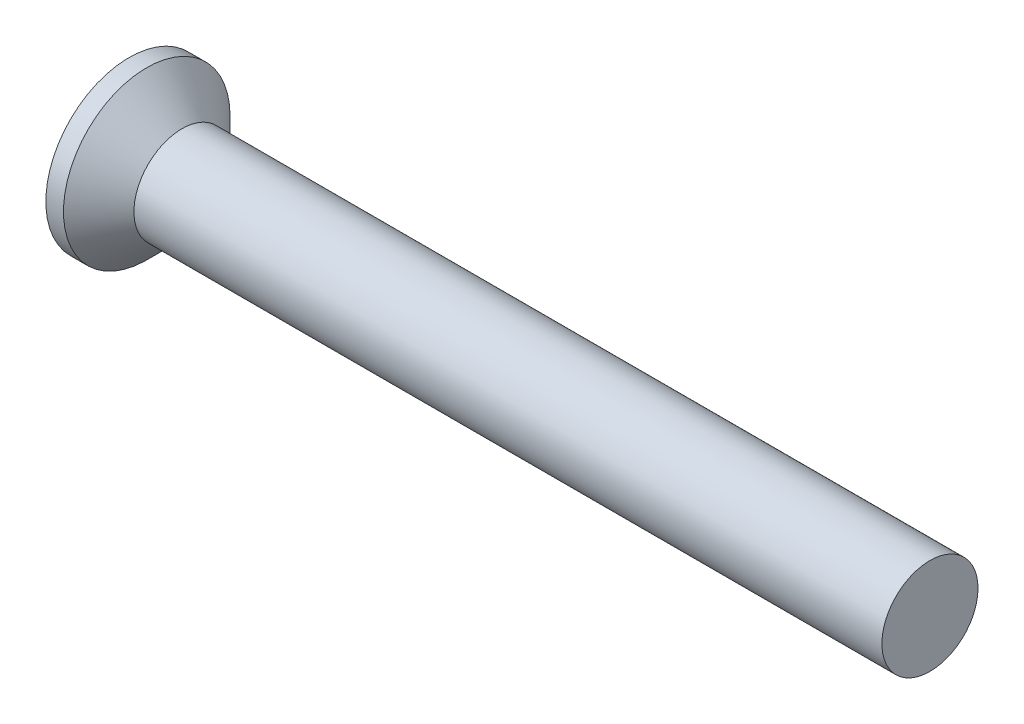
ISO-10303-21;
HEADER;
FILE_DESCRIPTION(('STEP AP214'),'2;1');
FILE_NAME('part.step','',(''),(''),'','','');
FILE_SCHEMA(('AUTOMOTIVE_DESIGN { 1 0 10303 214 1 1 1 1 }'));
ENDSEC;
DATA;
#1=APPLICATION_CONTEXT('core data for automotive mechanical design processes');
#2=APPLICATION_PROTOCOL_DEFINITION('international standard','automotive_design',2000,#1);
#3=PRODUCT_CONTEXT('',#1,'mechanical');
#4=PRODUCT('Part','Part','',(#3));
#5=PRODUCT_RELATED_PRODUCT_CATEGORY('part','',(#4));
#6=PRODUCT_DEFINITION_FORMATION('','',#4);
#7=PRODUCT_DEFINITION_CONTEXT('part definition',#1,'design');
#8=PRODUCT_DEFINITION('design','',#6,#7);
#9=PRODUCT_DEFINITION_SHAPE('','',#8);
#10=(LENGTH_UNIT() NAMED_UNIT(*) SI_UNIT(.MILLI.,.METRE.));
#11=(NAMED_UNIT(*) PLANE_ANGLE_UNIT() SI_UNIT($,.RADIAN.));
#12=(NAMED_UNIT(*) SI_UNIT($,.STERADIAN.) SOLID_ANGLE_UNIT());
#13=UNCERTAINTY_MEASURE_WITH_UNIT(LENGTH_MEASURE(1.E-05),#10,'distance_accuracy_value','');
#14=(GEOMETRIC_REPRESENTATION_CONTEXT(3) GLOBAL_UNCERTAINTY_ASSIGNED_CONTEXT((#13)) GLOBAL_UNIT_ASSIGNED_CONTEXT((#10,
#11,#12)) REPRESENTATION_CONTEXT('',''));
#15=CARTESIAN_POINT('',(0.,0.,0.));
#16=DIRECTION('',(0.,0.,1.));
#17=DIRECTION('',(1.,0.,0.));
#18=AXIS2_PLACEMENT_3D('',#15,#16,#17);
#19=CARTESIAN_POINT('',(0.,2.6,0.));
#20=DIRECTION('',(-1.,0.,0.));
#21=DIRECTION('',(0.,0.,1.));
#22=AXIS2_PLACEMENT_3D('',#19,#20,#21);
#23=PLANE('',#22);
#24=CARTESIAN_POINT('',(0.,0.,0.));
#25=DIRECTION('',(1.,0.,0.));
#26=DIRECTION('',(0.,0.,-1.));
#27=AXIS2_PLACEMENT_3D('',#24,#25,#26);
#28=CIRCLE('',#27,2.6);
#29=CARTESIAN_POINT('',(0.,0.,-2.6));
#30=VERTEX_POINT('',#29);
#31=EDGE_CURVE('E183',#30,#30,#28,.T.);
#32=ORIENTED_EDGE('',*,*,#31,.F.);
#33=EDGE_LOOP('',(#32));
#34=FACE_BOUND('',#33,.T.);
#35=DIRECTION('',(0.,1.,0.));
#36=VECTOR('',#35,1.);
#37=CARTESIAN_POINT('',(0.,-0.32,-0.32));
#38=LINE('',#37,#36);
#39=CARTESIAN_POINT('',(0.,-1.6,-0.32));
#40=VERTEX_POINT('',#39);
#41=CARTESIAN_POINT('',(0.,-0.62,-0.32));
#42=VERTEX_POINT('',#41);
#43=EDGE_CURVE('E287',#40,#42,#38,.T.);
#44=ORIENTED_EDGE('',*,*,#43,.T.);
#45=CARTESIAN_POINT('',(0.,-0.62,-0.62));
#46=DIRECTION('',(-1.,0.,0.));
#47=DIRECTION('',(0.,0.,1.));
#48=AXIS2_PLACEMENT_3D('',#45,#46,#47);
#49=CIRCLE('',#48,0.3);
#50=CARTESIAN_POINT('',(0.,-0.32,-0.62));
#51=VERTEX_POINT('',#50);
#52=EDGE_CURVE('E189',#42,#51,#49,.T.);
#53=ORIENTED_EDGE('',*,*,#52,.T.);
#54=DIRECTION('',(0.,0.,-1.));
#55=VECTOR('',#54,1.);
#56=CARTESIAN_POINT('',(0.,-0.32,-0.32));
#57=LINE('',#56,#55);
#58=CARTESIAN_POINT('',(0.,-0.32,-1.6));
#59=VERTEX_POINT('',#58);
#60=EDGE_CURVE('E282',#51,#59,#57,.T.);
#61=ORIENTED_EDGE('',*,*,#60,.T.);
#62=DIRECTION('',(0.,1.,0.));
#63=VECTOR('',#62,1.);
#64=CARTESIAN_POINT('',(0.,0.32,-1.6));
#65=LINE('',#64,#63);
#66=CARTESIAN_POINT('',(0.,0.32,-1.6));
#67=VERTEX_POINT('',#66);
#68=EDGE_CURVE('E246',#59,#67,#65,.T.);
#69=ORIENTED_EDGE('',*,*,#68,.T.);
#70=DIRECTION('',(0.,0.,1.));
#71=VECTOR('',#70,1.);
#72=CARTESIAN_POINT('',(0.,0.32,-0.32));
#73=LINE('',#72,#71);
#74=CARTESIAN_POINT('',(0.,0.32,-0.62));
#75=VERTEX_POINT('',#74);
#76=EDGE_CURVE('E236',#67,#75,#73,.T.);
#77=ORIENTED_EDGE('',*,*,#76,.T.);
#78=CARTESIAN_POINT('',(0.,0.62,-0.62));
#79=DIRECTION('',(-1.,0.,0.));
#80=DIRECTION('',(0.,0.,1.));
#81=AXIS2_PLACEMENT_3D('',#78,#79,#80);
#82=CIRCLE('',#81,0.3);
#83=CARTESIAN_POINT('',(0.,0.62,-0.32));
#84=VERTEX_POINT('',#83);
#85=EDGE_CURVE('E185',#75,#84,#82,.T.);
#86=ORIENTED_EDGE('',*,*,#85,.T.);
#87=DIRECTION('',(0.,1.,0.));
#88=VECTOR('',#87,1.);
#89=CARTESIAN_POINT('',(0.,0.32,-0.32));
#90=LINE('',#89,#88);
#91=CARTESIAN_POINT('',(0.,1.6,-0.32));
#92=VERTEX_POINT('',#91);
#93=EDGE_CURVE('E233',#84,#92,#90,.T.);
#94=ORIENTED_EDGE('',*,*,#93,.T.);
#95=DIRECTION('',(0.,0.,1.));
#96=VECTOR('',#95,1.);
#97=CARTESIAN_POINT('',(0.,1.6,-0.32));
#98=LINE('',#97,#96);
#99=CARTESIAN_POINT('',(0.,1.6,0.32));
#100=VERTEX_POINT('',#99);
#101=EDGE_CURVE('E242',#92,#100,#98,.T.);
#102=ORIENTED_EDGE('',*,*,#101,.T.);
#103=DIRECTION('',(0.,-1.,0.));
#104=VECTOR('',#103,1.);
#105=CARTESIAN_POINT('',(0.,0.32,0.32));
#106=LINE('',#105,#104);
#107=CARTESIAN_POINT('',(0.,0.62,0.32));
#108=VERTEX_POINT('',#107);
#109=EDGE_CURVE('E244',#100,#108,#106,.T.);
#110=ORIENTED_EDGE('',*,*,#109,.T.);
#111=CARTESIAN_POINT('',(0.,0.62,0.62));
#112=DIRECTION('',(-1.,0.,0.));
#113=DIRECTION('',(0.,0.,1.));
#114=AXIS2_PLACEMENT_3D('',#111,#112,#113);
#115=CIRCLE('',#114,0.3);
#116=CARTESIAN_POINT('',(0.,0.32,0.62));
#117=VERTEX_POINT('',#116);
#118=EDGE_CURVE('E155',#108,#117,#115,.T.);
#119=ORIENTED_EDGE('',*,*,#118,.T.);
#120=DIRECTION('',(0.,0.,1.));
#121=VECTOR('',#120,1.);
#122=CARTESIAN_POINT('',(0.,0.32,0.32));
#123=LINE('',#122,#121);
#124=CARTESIAN_POINT('',(0.,0.32,1.6));
#125=VERTEX_POINT('',#124);
#126=EDGE_CURVE('E149',#117,#125,#123,.T.);
#127=ORIENTED_EDGE('',*,*,#126,.T.);
#128=DIRECTION('',(0.,-1.,0.));
#129=VECTOR('',#128,1.);
#130=CARTESIAN_POINT('',(0.,0.32,1.6));
#131=LINE('',#130,#129);
#132=CARTESIAN_POINT('',(0.,-0.32,1.6));
#133=VERTEX_POINT('',#132);
#134=EDGE_CURVE('E153',#125,#133,#131,.T.);
#135=ORIENTED_EDGE('',*,*,#134,.T.);
#136=DIRECTION('',(0.,0.,-1.));
#137=VECTOR('',#136,1.);
#138=CARTESIAN_POINT('',(0.,-0.32,0.32));
#139=LINE('',#138,#137);
#140=CARTESIAN_POINT('',(0.,-0.32,0.62));
#141=VERTEX_POINT('',#140);
#142=EDGE_CURVE('E165',#133,#141,#139,.T.);
#143=ORIENTED_EDGE('',*,*,#142,.T.);
#144=CARTESIAN_POINT('',(0.,-0.62,0.62));
#145=DIRECTION('',(-1.,0.,0.));
#146=DIRECTION('',(0.,0.,1.));
#147=AXIS2_PLACEMENT_3D('',#144,#145,#146);
#148=CIRCLE('',#147,0.3);
#149=CARTESIAN_POINT('',(0.,-0.62,0.32));
#150=VERTEX_POINT('',#149);
#151=EDGE_CURVE('E187',#141,#150,#148,.T.);
#152=ORIENTED_EDGE('',*,*,#151,.T.);
#153=DIRECTION('',(0.,-1.,0.));
#154=VECTOR('',#153,1.);
#155=CARTESIAN_POINT('',(0.,-0.32,0.32));
#156=LINE('',#155,#154);
#157=CARTESIAN_POINT('',(0.,-1.6,0.319999999999999));
#158=VERTEX_POINT('',#157);
#159=EDGE_CURVE('E294',#150,#158,#156,.T.);
#160=ORIENTED_EDGE('',*,*,#159,.T.);
#161=DIRECTION('',(0.,0.,-1.));
#162=VECTOR('',#161,1.);
#163=CARTESIAN_POINT('',(0.,-1.6,-0.32));
#164=LINE('',#163,#162);
#165=EDGE_CURVE('E291',#158,#40,#164,.T.);
#166=ORIENTED_EDGE('',*,*,#165,.T.);
#167=EDGE_LOOP('',(#44,#53,#61,#69,#77,#86,#94,#102,#110,#119,#127,#135,#143,#152,#160,#166));
#168=FACE_BOUND('',#167,.T.);
#169=ADVANCED_FACE('F37',(#34,#168),#23,.T.);
#170=CARTESIAN_POINT('',(25.,1.5,0.));
#171=DIRECTION('',(1.,0.,0.));
#172=DIRECTION('',(0.,0.,-1.));
#173=AXIS2_PLACEMENT_3D('',#170,#171,#172);
#174=PLANE('',#173);
#175=CARTESIAN_POINT('',(25.,0.,0.));
#176=DIRECTION('',(1.,0.,0.));
#177=DIRECTION('',(0.,0.,-1.));
#178=AXIS2_PLACEMENT_3D('',#175,#176,#177);
#179=CIRCLE('',#178,1.5);
#180=CARTESIAN_POINT('',(25.,0.,-1.5));
#181=VERTEX_POINT('',#180);
#182=EDGE_CURVE('E170',#181,#181,#179,.T.);
#183=ORIENTED_EDGE('',*,*,#182,.T.);
#184=EDGE_LOOP('',(#183));
#185=FACE_BOUND('',#184,.T.);
#186=ADVANCED_FACE('F343',(#185),#174,.T.);
#187=CARTESIAN_POINT('',(4.51581291088132,0.,0.));
#188=DIRECTION('',(1.,0.,0.));
#189=DIRECTION('',(0.,0.,-1.));
#190=AXIS2_PLACEMENT_3D('',#187,#188,#189);
#191=CYLINDRICAL_SURFACE('',#190,2.6);
#192=ORIENTED_EDGE('',*,*,#31,.T.);
#193=EDGE_LOOP('',(#192));
#194=FACE_BOUND('',#193,.T.);
#195=CARTESIAN_POINT('',(0.550000000000004,0.,0.));
#196=DIRECTION('',(1.,0.,0.));
#197=DIRECTION('',(0.,0.,-1.));
#198=AXIS2_PLACEMENT_3D('',#195,#196,#197);
#199=CIRCLE('',#198,2.6);
#200=CARTESIAN_POINT('',(0.550000000000004,0.,-2.6));
#201=VERTEX_POINT('',#200);
#202=EDGE_CURVE('E253',#201,#201,#199,.T.);
#203=ORIENTED_EDGE('',*,*,#202,.F.);
#204=EDGE_LOOP('',(#203));
#205=FACE_BOUND('',#204,.T.);
#206=ADVANCED_FACE('F349',(#194,#205),#191,.T.);
#207=CARTESIAN_POINT('',(1.65,0.,0.));
#208=DIRECTION('',(-1.,0.,0.));
#209=DIRECTION('',(0.,0.,1.));
#210=AXIS2_PLACEMENT_3D('',#207,#208,#209);
#211=CONICAL_SURFACE('',#210,1.5,0.78539816339745);
#212=ORIENTED_EDGE('',*,*,#202,.T.);
#213=EDGE_LOOP('',(#212));
#214=FACE_BOUND('',#213,.T.);
#215=CARTESIAN_POINT('',(1.65,0.,0.));
#216=DIRECTION('',(1.,0.,0.));
#217=DIRECTION('',(0.,0.,-1.));
#218=AXIS2_PLACEMENT_3D('',#215,#216,#217);
#219=CIRCLE('',#218,1.5);
#220=CARTESIAN_POINT('',(1.65,0.,-1.5));
#221=VERTEX_POINT('',#220);
#222=EDGE_CURVE('E173',#221,#221,#219,.T.);
#223=ORIENTED_EDGE('',*,*,#222,.F.);
#224=EDGE_LOOP('',(#223));
#225=FACE_BOUND('',#224,.T.);
#226=ADVANCED_FACE('F489',(#214,#225),#211,.T.);
#227=CARTESIAN_POINT('',(4.51581291088132,0.,0.));
#228=DIRECTION('',(1.,0.,0.));
#229=DIRECTION('',(0.,0.,-1.));
#230=AXIS2_PLACEMENT_3D('',#227,#228,#229);
#231=CYLINDRICAL_SURFACE('',#230,1.5);
#232=ORIENTED_EDGE('',*,*,#182,.F.);
#233=EDGE_LOOP('',(#232));
#234=FACE_BOUND('',#233,.T.);
#235=ORIENTED_EDGE('',*,*,#222,.T.);
#236=EDGE_LOOP('',(#235));
#237=FACE_BOUND('',#236,.T.);
#238=ADVANCED_FACE('F459',(#234,#237),#231,.T.);
#239=CARTESIAN_POINT('',(0.825,0.32,0.32));
#240=DIRECTION('',(0.,-1.,0.));
#241=DIRECTION('',(0.,0.,-1.));
#242=AXIS2_PLACEMENT_3D('',#239,#240,#241);
#243=PLANE('',#242);
#244=ORIENTED_EDGE('',*,*,#126,.F.);
#245=DIRECTION('',(-1.,0.,0.));
#246=VECTOR('',#245,1.);
#247=CARTESIAN_POINT('',(0.825,0.32,0.62));
#248=LINE('',#247,#246);
#249=CARTESIAN_POINT('',(0.825,0.32,0.62));
#250=VERTEX_POINT('',#249);
#251=EDGE_CURVE('E52',#117,#250,#248,.F.);
#252=ORIENTED_EDGE('',*,*,#251,.T.);
#253=DIRECTION('',(0.,0.,1.));
#254=VECTOR('',#253,1.);
#255=CARTESIAN_POINT('',(0.825,0.32,0.32));
#256=LINE('',#255,#254);
#257=CARTESIAN_POINT('',(0.825,0.32,1.12368602791856));
#258=VERTEX_POINT('',#257);
#259=EDGE_CURVE('E168',#250,#258,#256,.T.);
#260=ORIENTED_EDGE('',*,*,#259,.T.);
#261=DIRECTION('',(-0.866025403784438,0.,0.500000000000001));
#262=VECTOR('',#261,1.);
#263=CARTESIAN_POINT('',(0.,0.32,1.6));
#264=LINE('',#263,#262);
#265=EDGE_CURVE('E161',#258,#125,#264,.T.);
#266=ORIENTED_EDGE('',*,*,#265,.T.);
#267=EDGE_LOOP('',(#244,#252,#260,#266));
#268=FACE_BOUND('',#267,.T.);
#269=ADVANCED_FACE('F167',(#268),#243,.T.);
#270=CARTESIAN_POINT('',(0.,0.32,1.6));
#271=DIRECTION('',(-0.500000000000001,0.,-0.866025403784438));
#272=DIRECTION('',(-0.866025403784438,0.,0.500000000000001));
#273=AXIS2_PLACEMENT_3D('',#270,#271,#272);
#274=PLANE('',#273);
#275=ORIENTED_EDGE('',*,*,#134,.F.);
#276=ORIENTED_EDGE('',*,*,#265,.F.);
#277=DIRECTION('',(0.,-1.,0.));
#278=VECTOR('',#277,1.);
#279=CARTESIAN_POINT('',(0.825,0.32,1.12368602791856));
#280=LINE('',#279,#278);
#281=CARTESIAN_POINT('',(0.825,-0.32,1.12368602791856));
#282=VERTEX_POINT('',#281);
#283=EDGE_CURVE('E179',#258,#282,#280,.T.);
#284=ORIENTED_EDGE('',*,*,#283,.T.);
#285=DIRECTION('',(-0.866025403784438,0.,0.500000000000001));
#286=VECTOR('',#285,1.);
#287=CARTESIAN_POINT('',(1.17300625842204,-0.32,0.922764520938917));
#288=LINE('',#287,#286);
#289=EDGE_CURVE('E163',#282,#133,#288,.T.);
#290=ORIENTED_EDGE('',*,*,#289,.T.);
#291=EDGE_LOOP('',(#275,#276,#284,#290));
#292=FACE_BOUND('',#291,.T.);
#293=ADVANCED_FACE('F160',(#292),#274,.T.);
#294=CARTESIAN_POINT('',(0.825,-0.32,0.32));
#295=DIRECTION('',(0.,1.,0.));
#296=DIRECTION('',(0.,0.,1.));
#297=AXIS2_PLACEMENT_3D('',#294,#295,#296);
#298=PLANE('',#297);
#299=DIRECTION('',(0.,0.,-1.));
#300=VECTOR('',#299,1.);
#301=CARTESIAN_POINT('',(0.825,-0.32,0.32));
#302=LINE('',#301,#300);
#303=CARTESIAN_POINT('',(0.825,-0.32,0.62));
#304=VERTEX_POINT('',#303);
#305=EDGE_CURVE('E303',#282,#304,#302,.T.);
#306=ORIENTED_EDGE('',*,*,#305,.T.);
#307=DIRECTION('',(-1.,0.,0.));
#308=VECTOR('',#307,1.);
#309=CARTESIAN_POINT('',(0.825,-0.32,0.62));
#310=LINE('',#309,#308);
#311=EDGE_CURVE('E193',#304,#141,#310,.T.);
#312=ORIENTED_EDGE('',*,*,#311,.T.);
#313=ORIENTED_EDGE('',*,*,#142,.F.);
#314=ORIENTED_EDGE('',*,*,#289,.F.);
#315=EDGE_LOOP('',(#306,#312,#313,#314));
#316=FACE_BOUND('',#315,.T.);
#317=ADVANCED_FACE('F308',(#316),#298,.T.);
#318=CARTESIAN_POINT('',(0.825,-0.32,0.32));
#319=DIRECTION('',(0.,0.,-1.));
#320=DIRECTION('',(0.,1.,0.));
#321=AXIS2_PLACEMENT_3D('',#318,#319,#320);
#322=PLANE('',#321);
#323=ORIENTED_EDGE('',*,*,#159,.F.);
#324=DIRECTION('',(-1.,0.,0.));
#325=VECTOR('',#324,1.);
#326=CARTESIAN_POINT('',(0.825,-0.62,0.32));
#327=LINE('',#326,#325);
#328=CARTESIAN_POINT('',(0.825,-0.62,0.32));
#329=VERTEX_POINT('',#328);
#330=EDGE_CURVE('E196',#150,#329,#327,.F.);
#331=ORIENTED_EDGE('',*,*,#330,.T.);
#332=DIRECTION('',(0.,-1.,0.));
#333=VECTOR('',#332,1.);
#334=CARTESIAN_POINT('',(0.825,-0.32,0.32));
#335=LINE('',#334,#333);
#336=CARTESIAN_POINT('',(0.825,-1.12368602791856,0.32));
#337=VERTEX_POINT('',#336);
#338=EDGE_CURVE('E264',#329,#337,#335,.T.);
#339=ORIENTED_EDGE('',*,*,#338,.T.);
#340=DIRECTION('',(-0.866025403784438,-0.500000000000001,0.));
#341=VECTOR('',#340,1.);
#342=CARTESIAN_POINT('',(0.,-1.6,0.319999999999999));
#343=LINE('',#342,#341);
#344=EDGE_CURVE('E175',#337,#158,#343,.T.);
#345=ORIENTED_EDGE('',*,*,#344,.T.);
#346=EDGE_LOOP('',(#323,#331,#339,#345));
#347=FACE_BOUND('',#346,.T.);
#348=ADVANCED_FACE('F318',(#347),#322,.T.);
#349=CARTESIAN_POINT('',(0.,-1.6,-0.32));
#350=DIRECTION('',(-0.500000000000001,0.866025403784438,0.));
#351=DIRECTION('',(-0.866025403784438,-0.500000000000001,0.));
#352=AXIS2_PLACEMENT_3D('',#349,#350,#351);
#353=PLANE('',#352);
#354=ORIENTED_EDGE('',*,*,#165,.F.);
#355=ORIENTED_EDGE('',*,*,#344,.F.);
#356=DIRECTION('',(0.,0.,-1.));
#357=VECTOR('',#356,1.);
#358=CARTESIAN_POINT('',(0.825,-1.12368602791856,-0.32));
#359=LINE('',#358,#357);
#360=CARTESIAN_POINT('',(0.825,-1.12368602791856,-0.32));
#361=VERTEX_POINT('',#360);
#362=EDGE_CURVE('E261',#337,#361,#359,.T.);
#363=ORIENTED_EDGE('',*,*,#362,.T.);
#364=DIRECTION('',(-0.866025403784438,-0.500000000000001,0.));
#365=VECTOR('',#364,1.);
#366=CARTESIAN_POINT('',(1.17300625842204,-0.922764520938918,-0.32));
#367=LINE('',#366,#365);
#368=EDGE_CURVE('E258',#361,#40,#367,.T.);
#369=ORIENTED_EDGE('',*,*,#368,.T.);
#370=EDGE_LOOP('',(#354,#355,#363,#369));
#371=FACE_BOUND('',#370,.T.);
#372=ADVANCED_FACE('F322',(#371),#353,.T.);
#373=CARTESIAN_POINT('',(0.825,-0.32,-0.32));
#374=DIRECTION('',(0.,0.,1.));
#375=DIRECTION('',(0.,-1.,0.));
#376=AXIS2_PLACEMENT_3D('',#373,#374,#375);
#377=PLANE('',#376);
#378=DIRECTION('',(0.,1.,0.));
#379=VECTOR('',#378,1.);
#380=CARTESIAN_POINT('',(0.825,-0.32,-0.32));
#381=LINE('',#380,#379);
#382=CARTESIAN_POINT('',(0.825,-0.62,-0.32));
#383=VERTEX_POINT('',#382);
#384=EDGE_CURVE('E263',#361,#383,#381,.T.);
#385=ORIENTED_EDGE('',*,*,#384,.T.);
#386=DIRECTION('',(-1.,0.,0.));
#387=VECTOR('',#386,1.);
#388=CARTESIAN_POINT('',(0.825,-0.62,-0.32));
#389=LINE('',#388,#387);
#390=EDGE_CURVE('E180',#383,#42,#389,.T.);
#391=ORIENTED_EDGE('',*,*,#390,.T.);
#392=ORIENTED_EDGE('',*,*,#43,.F.);
#393=ORIENTED_EDGE('',*,*,#368,.F.);
#394=EDGE_LOOP('',(#385,#391,#392,#393));
#395=FACE_BOUND('',#394,.T.);
#396=ADVANCED_FACE('F326',(#395),#377,.T.);
#397=CARTESIAN_POINT('',(0.825,-0.32,-0.32));
#398=DIRECTION('',(0.,1.,0.));
#399=DIRECTION('',(0.,0.,1.));
#400=AXIS2_PLACEMENT_3D('',#397,#398,#399);
#401=PLANE('',#400);
#402=ORIENTED_EDGE('',*,*,#60,.F.);
#403=DIRECTION('',(-1.,0.,0.));
#404=VECTOR('',#403,1.);
#405=CARTESIAN_POINT('',(0.825,-0.32,-0.62));
#406=LINE('',#405,#404);
#407=CARTESIAN_POINT('',(0.825,-0.32,-0.62));
#408=VERTEX_POINT('',#407);
#409=EDGE_CURVE('E191',#51,#408,#406,.F.);
#410=ORIENTED_EDGE('',*,*,#409,.T.);
#411=DIRECTION('',(0.,0.,-1.));
#412=VECTOR('',#411,1.);
#413=CARTESIAN_POINT('',(0.825,-0.32,-0.32));
#414=LINE('',#413,#412);
#415=CARTESIAN_POINT('',(0.825,-0.32,-1.12368602791856));
#416=VERTEX_POINT('',#415);
#417=EDGE_CURVE('E275',#408,#416,#414,.T.);
#418=ORIENTED_EDGE('',*,*,#417,.T.);
#419=DIRECTION('',(-0.866025403784438,0.,-0.500000000000001));
#420=VECTOR('',#419,1.);
#421=CARTESIAN_POINT('',(0.,-0.32,-1.6));
#422=LINE('',#421,#420);
#423=EDGE_CURVE('E260',#416,#59,#422,.T.);
#424=ORIENTED_EDGE('',*,*,#423,.T.);
#425=EDGE_LOOP('',(#402,#410,#418,#424));
#426=FACE_BOUND('',#425,.T.);
#427=ADVANCED_FACE('F281',(#426),#401,.T.);
#428=CARTESIAN_POINT('',(0.,0.32,-1.6));
#429=DIRECTION('',(-0.500000000000001,0.,0.866025403784438));
#430=DIRECTION('',(0.866025403784438,0.,0.500000000000001));
#431=AXIS2_PLACEMENT_3D('',#428,#429,#430);
#432=PLANE('',#431);
#433=ORIENTED_EDGE('',*,*,#68,.F.);
#434=ORIENTED_EDGE('',*,*,#423,.F.);
#435=DIRECTION('',(0.,1.,0.));
#436=VECTOR('',#435,1.);
#437=CARTESIAN_POINT('',(0.825,0.32,-1.12368602791856));
#438=LINE('',#437,#436);
#439=CARTESIAN_POINT('',(0.825,0.32,-1.12368602791856));
#440=VERTEX_POINT('',#439);
#441=EDGE_CURVE('E228',#416,#440,#438,.T.);
#442=ORIENTED_EDGE('',*,*,#441,.T.);
#443=DIRECTION('',(-0.866025403784438,0.,-0.500000000000001));
#444=VECTOR('',#443,1.);
#445=CARTESIAN_POINT('',(1.17300625842204,0.32,-0.922764520938917));
#446=LINE('',#445,#444);
#447=EDGE_CURVE('E227',#440,#67,#446,.T.);
#448=ORIENTED_EDGE('',*,*,#447,.T.);
#449=EDGE_LOOP('',(#433,#434,#442,#448));
#450=FACE_BOUND('',#449,.T.);
#451=ADVANCED_FACE('F286',(#450),#432,.T.);
#452=CARTESIAN_POINT('',(0.825,0.32,-0.32));
#453=DIRECTION('',(0.,-1.,0.));
#454=DIRECTION('',(0.,0.,-1.));
#455=AXIS2_PLACEMENT_3D('',#452,#453,#454);
#456=PLANE('',#455);
#457=DIRECTION('',(0.,0.,1.));
#458=VECTOR('',#457,1.);
#459=CARTESIAN_POINT('',(0.825,0.32,-0.32));
#460=LINE('',#459,#458);
#461=CARTESIAN_POINT('',(0.825,0.32,-0.62));
#462=VERTEX_POINT('',#461);
#463=EDGE_CURVE('E216',#440,#462,#460,.T.);
#464=ORIENTED_EDGE('',*,*,#463,.T.);
#465=DIRECTION('',(-1.,0.,0.));
#466=VECTOR('',#465,1.);
#467=CARTESIAN_POINT('',(0.825,0.32,-0.62));
#468=LINE('',#467,#466);
#469=EDGE_CURVE('E198',#462,#75,#468,.T.);
#470=ORIENTED_EDGE('',*,*,#469,.T.);
#471=ORIENTED_EDGE('',*,*,#76,.F.);
#472=ORIENTED_EDGE('',*,*,#447,.F.);
#473=EDGE_LOOP('',(#464,#470,#471,#472));
#474=FACE_BOUND('',#473,.T.);
#475=ADVANCED_FACE('F224',(#474),#456,.T.);
#476=CARTESIAN_POINT('',(0.825,0.32,-0.32));
#477=DIRECTION('',(0.,0.,1.));
#478=DIRECTION('',(0.,-1.,0.));
#479=AXIS2_PLACEMENT_3D('',#476,#477,#478);
#480=PLANE('',#479);
#481=ORIENTED_EDGE('',*,*,#93,.F.);
#482=DIRECTION('',(-1.,0.,0.));
#483=VECTOR('',#482,1.);
#484=CARTESIAN_POINT('',(0.825,0.62,-0.32));
#485=LINE('',#484,#483);
#486=CARTESIAN_POINT('',(0.825,0.62,-0.32));
#487=VERTEX_POINT('',#486);
#488=EDGE_CURVE('E201',#84,#487,#485,.F.);
#489=ORIENTED_EDGE('',*,*,#488,.T.);
#490=DIRECTION('',(0.,1.,0.));
#491=VECTOR('',#490,1.);
#492=CARTESIAN_POINT('',(0.825,0.32,-0.32));
#493=LINE('',#492,#491);
#494=CARTESIAN_POINT('',(0.825,1.12368602791856,-0.32));
#495=VERTEX_POINT('',#494);
#496=EDGE_CURVE('E218',#487,#495,#493,.T.);
#497=ORIENTED_EDGE('',*,*,#496,.T.);
#498=DIRECTION('',(-0.866025403784438,0.500000000000001,0.));
#499=VECTOR('',#498,1.);
#500=CARTESIAN_POINT('',(0.,1.6,-0.32));
#501=LINE('',#500,#499);
#502=EDGE_CURVE('E240',#495,#92,#501,.T.);
#503=ORIENTED_EDGE('',*,*,#502,.T.);
#504=EDGE_LOOP('',(#481,#489,#497,#503));
#505=FACE_BOUND('',#504,.T.);
#506=ADVANCED_FACE('F238',(#505),#480,.T.);
#507=CARTESIAN_POINT('',(0.,1.6,-0.32));
#508=DIRECTION('',(-0.500000000000001,-0.866025403784438,0.));
#509=DIRECTION('',(0.866025403784438,-0.500000000000001,0.));
#510=AXIS2_PLACEMENT_3D('',#507,#508,#509);
#511=PLANE('',#510);
#512=ORIENTED_EDGE('',*,*,#101,.F.);
#513=ORIENTED_EDGE('',*,*,#502,.F.);
#514=DIRECTION('',(0.,0.,1.));
#515=VECTOR('',#514,1.);
#516=CARTESIAN_POINT('',(0.825,1.12368602791856,-0.32));
#517=LINE('',#516,#515);
#518=CARTESIAN_POINT('',(0.825,1.12368602791856,0.32));
#519=VERTEX_POINT('',#518);
#520=EDGE_CURVE('E270',#495,#519,#517,.T.);
#521=ORIENTED_EDGE('',*,*,#520,.T.);
#522=DIRECTION('',(-0.866025403784438,0.500000000000001,0.));
#523=VECTOR('',#522,1.);
#524=CARTESIAN_POINT('',(1.17300625842204,0.922764520938918,0.32));
#525=LINE('',#524,#523);
#526=EDGE_CURVE('E267',#519,#100,#525,.T.);
#527=ORIENTED_EDGE('',*,*,#526,.T.);
#528=EDGE_LOOP('',(#512,#513,#521,#527));
#529=FACE_BOUND('',#528,.T.);
#530=ADVANCED_FACE('F361',(#529),#511,.T.);
#531=CARTESIAN_POINT('',(0.825,0.32,0.32));
#532=DIRECTION('',(0.,0.,-1.));
#533=DIRECTION('',(0.,1.,0.));
#534=AXIS2_PLACEMENT_3D('',#531,#532,#533);
#535=PLANE('',#534);
#536=DIRECTION('',(0.,-1.,0.));
#537=VECTOR('',#536,1.);
#538=CARTESIAN_POINT('',(0.825,0.32,0.32));
#539=LINE('',#538,#537);
#540=CARTESIAN_POINT('',(0.825,0.62,0.32));
#541=VERTEX_POINT('',#540);
#542=EDGE_CURVE('E269',#519,#541,#539,.T.);
#543=ORIENTED_EDGE('',*,*,#542,.T.);
#544=DIRECTION('',(-1.,0.,0.));
#545=VECTOR('',#544,1.);
#546=CARTESIAN_POINT('',(0.825,0.62,0.32));
#547=LINE('',#546,#545);
#548=EDGE_CURVE('E203',#541,#108,#547,.T.);
#549=ORIENTED_EDGE('',*,*,#548,.T.);
#550=ORIENTED_EDGE('',*,*,#109,.F.);
#551=ORIENTED_EDGE('',*,*,#526,.F.);
#552=EDGE_LOOP('',(#543,#549,#550,#551));
#553=FACE_BOUND('',#552,.T.);
#554=ADVANCED_FACE('F339',(#553),#535,.T.);
#555=CARTESIAN_POINT('',(0.825,0.32,0.32));
#556=DIRECTION('',(1.,0.,0.));
#557=DIRECTION('',(0.,0.,-1.));
#558=AXIS2_PLACEMENT_3D('',#555,#556,#557);
#559=PLANE('',#558);
#560=ORIENTED_EDGE('',*,*,#259,.F.);
#561=CARTESIAN_POINT('',(0.825,0.62,0.62));
#562=DIRECTION('',(1.,0.,0.));
#563=DIRECTION('',(0.,0.,-1.));
#564=AXIS2_PLACEMENT_3D('',#561,#562,#563);
#565=CIRCLE('',#564,0.3);
#566=EDGE_CURVE('E11',#250,#541,#565,.T.);
#567=ORIENTED_EDGE('',*,*,#566,.T.);
#568=ORIENTED_EDGE('',*,*,#542,.F.);
#569=ORIENTED_EDGE('',*,*,#520,.F.);
#570=ORIENTED_EDGE('',*,*,#496,.F.);
#571=CARTESIAN_POINT('',(0.825,0.62,-0.62));
#572=DIRECTION('',(1.,0.,0.));
#573=DIRECTION('',(0.,0.,-1.));
#574=AXIS2_PLACEMENT_3D('',#571,#572,#573);
#575=CIRCLE('',#574,0.3);
#576=EDGE_CURVE('E45',#487,#462,#575,.T.);
#577=ORIENTED_EDGE('',*,*,#576,.T.);
#578=ORIENTED_EDGE('',*,*,#463,.F.);
#579=ORIENTED_EDGE('',*,*,#441,.F.);
#580=ORIENTED_EDGE('',*,*,#417,.F.);
#581=CARTESIAN_POINT('',(0.825,-0.62,-0.62));
#582=DIRECTION('',(1.,0.,0.));
#583=DIRECTION('',(0.,0.,-1.));
#584=AXIS2_PLACEMENT_3D('',#581,#582,#583);
#585=CIRCLE('',#584,0.3);
#586=EDGE_CURVE('E207',#408,#383,#585,.T.);
#587=ORIENTED_EDGE('',*,*,#586,.T.);
#588=ORIENTED_EDGE('',*,*,#384,.F.);
#589=ORIENTED_EDGE('',*,*,#362,.F.);
#590=ORIENTED_EDGE('',*,*,#338,.F.);
#591=CARTESIAN_POINT('',(0.825,-0.62,0.62));
#592=DIRECTION('',(1.,0.,0.));
#593=DIRECTION('',(0.,0.,-1.));
#594=AXIS2_PLACEMENT_3D('',#591,#592,#593);
#595=CIRCLE('',#594,0.3);
#596=EDGE_CURVE('E209',#329,#304,#595,.T.);
#597=ORIENTED_EDGE('',*,*,#596,.T.);
#598=ORIENTED_EDGE('',*,*,#305,.F.);
#599=ORIENTED_EDGE('',*,*,#283,.F.);
#600=EDGE_LOOP('',(#560,#567,#568,#569,#570,#577,#578,#579,#580,#587,#588,#589,#590,#597,#598,#599));
#601=FACE_BOUND('',#600,.T.);
#602=ADVANCED_FACE('F214',(#601),#559,.F.);
#603=CARTESIAN_POINT('',(0.825,-0.62,-0.62));
#604=DIRECTION('',(-1.,0.,0.));
#605=DIRECTION('',(0.,0.,1.));
#606=AXIS2_PLACEMENT_3D('',#603,#604,#605);
#607=CYLINDRICAL_SURFACE('',#606,0.3);
#608=ORIENTED_EDGE('',*,*,#586,.F.);
#609=ORIENTED_EDGE('',*,*,#409,.F.);
#610=ORIENTED_EDGE('',*,*,#52,.F.);
#611=ORIENTED_EDGE('',*,*,#390,.F.);
#612=EDGE_LOOP('',(#608,#609,#610,#611));
#613=FACE_BOUND('',#612,.T.);
#614=ADVANCED_FACE('F331',(#613),#607,.T.);
#615=CARTESIAN_POINT('',(0.825,-0.62,0.62));
#616=DIRECTION('',(-1.,0.,0.));
#617=DIRECTION('',(0.,0.,1.));
#618=AXIS2_PLACEMENT_3D('',#615,#616,#617);
#619=CYLINDRICAL_SURFACE('',#618,0.3);
#620=ORIENTED_EDGE('',*,*,#596,.F.);
#621=ORIENTED_EDGE('',*,*,#330,.F.);
#622=ORIENTED_EDGE('',*,*,#151,.F.);
#623=ORIENTED_EDGE('',*,*,#311,.F.);
#624=EDGE_LOOP('',(#620,#621,#622,#623));
#625=FACE_BOUND('',#624,.T.);
#626=ADVANCED_FACE('F315',(#625),#619,.T.);
#627=CARTESIAN_POINT('',(0.825,0.62,-0.62));
#628=DIRECTION('',(-1.,0.,0.));
#629=DIRECTION('',(0.,0.,1.));
#630=AXIS2_PLACEMENT_3D('',#627,#628,#629);
#631=CYLINDRICAL_SURFACE('',#630,0.3);
#632=ORIENTED_EDGE('',*,*,#576,.F.);
#633=ORIENTED_EDGE('',*,*,#488,.F.);
#634=ORIENTED_EDGE('',*,*,#85,.F.);
#635=ORIENTED_EDGE('',*,*,#469,.F.);
#636=EDGE_LOOP('',(#632,#633,#634,#635));
#637=FACE_BOUND('',#636,.T.);
#638=ADVANCED_FACE('F230',(#637),#631,.T.);
#639=CARTESIAN_POINT('',(0.825,0.62,0.62));
#640=DIRECTION('',(-1.,0.,0.));
#641=DIRECTION('',(0.,0.,1.));
#642=AXIS2_PLACEMENT_3D('',#639,#640,#641);
#643=CYLINDRICAL_SURFACE('',#642,0.3);
#644=ORIENTED_EDGE('',*,*,#566,.F.);
#645=ORIENTED_EDGE('',*,*,#251,.F.);
#646=ORIENTED_EDGE('',*,*,#118,.F.);
#647=ORIENTED_EDGE('',*,*,#548,.F.);
#648=EDGE_LOOP('',(#644,#645,#646,#647));
#649=FACE_BOUND('',#648,.T.);
#650=ADVANCED_FACE('F39',(#649),#643,.T.);
#651=CLOSED_SHELL('',(#169,#186,#206,#226,#238,#269,#293,#317,#348,#372,#396,#427,#451,#475,
#506,#530,#554,#602,#614,#626,#638,#650));
#652=MANIFOLD_SOLID_BREP('B2',#651);
#653=ADVANCED_BREP_SHAPE_REPRESENTATION('',(#18,#652),#14);
#654=SHAPE_DEFINITION_REPRESENTATION(#9,#653);
ENDSEC;
END-ISO-10303-21;
